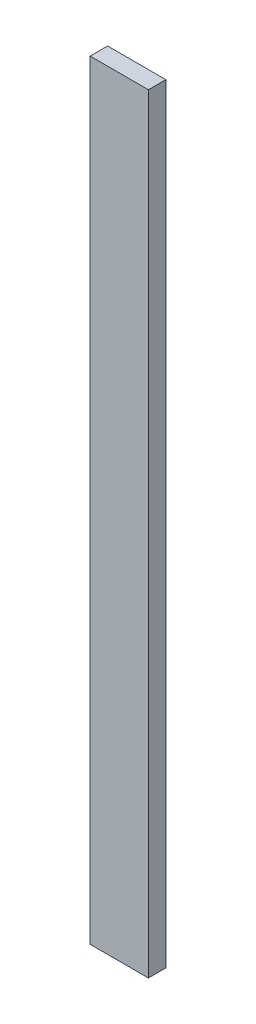
ISO-10303-21;
HEADER;
FILE_DESCRIPTION(('STEP AP214'),'2;1');
FILE_NAME('part.step','',(''),(''),'','','');
FILE_SCHEMA(('AUTOMOTIVE_DESIGN { 1 0 10303 214 1 1 1 1 }'));
ENDSEC;
DATA;
#1=APPLICATION_CONTEXT('core data for automotive mechanical design processes');
#2=APPLICATION_PROTOCOL_DEFINITION('international standard','automotive_design',2000,#1);
#3=PRODUCT_CONTEXT('',#1,'mechanical');
#4=PRODUCT('Part','Part','',(#3));
#5=PRODUCT_RELATED_PRODUCT_CATEGORY('part','',(#4));
#6=PRODUCT_DEFINITION_FORMATION('','',#4);
#7=PRODUCT_DEFINITION_CONTEXT('part definition',#1,'design');
#8=PRODUCT_DEFINITION('design','',#6,#7);
#9=PRODUCT_DEFINITION_SHAPE('','',#8);
#10=(LENGTH_UNIT() NAMED_UNIT(*) SI_UNIT(.MILLI.,.METRE.));
#11=(NAMED_UNIT(*) PLANE_ANGLE_UNIT() SI_UNIT($,.RADIAN.));
#12=(NAMED_UNIT(*) SI_UNIT($,.STERADIAN.) SOLID_ANGLE_UNIT());
#13=UNCERTAINTY_MEASURE_WITH_UNIT(LENGTH_MEASURE(1.E-05),#10,'distance_accuracy_value','');
#14=(GEOMETRIC_REPRESENTATION_CONTEXT(3) GLOBAL_UNCERTAINTY_ASSIGNED_CONTEXT((#13)) GLOBAL_UNIT_ASSIGNED_CONTEXT((#10,
#11,#12)) REPRESENTATION_CONTEXT('',''));
#15=CARTESIAN_POINT('',(0.,0.,0.));
#16=DIRECTION('',(0.,0.,1.));
#17=DIRECTION('',(1.,0.,0.));
#18=AXIS2_PLACEMENT_3D('',#15,#16,#17);
#19=CARTESIAN_POINT('',(-49.1419551742583,806.824751696435,19.05));
#20=DIRECTION('',(0.,-1.,0.));
#21=DIRECTION('',(0.,0.,-1.));
#22=AXIS2_PLACEMENT_3D('',#19,#20,#21);
#23=PLANE('',#22);
#24=DIRECTION('',(-1.,0.,0.));
#25=VECTOR('',#24,1.);
#26=CARTESIAN_POINT('',(-49.1419551742583,806.824751696435,0.));
#27=LINE('',#26,#25);
#28=CARTESIAN_POINT('',(14.3580448257418,806.824751696435,0.));
#29=VERTEX_POINT('',#28);
#30=CARTESIAN_POINT('',(-49.1419551742583,806.824751696435,0.));
#31=VERTEX_POINT('',#30);
#32=EDGE_CURVE('E95',#29,#31,#27,.T.);
#33=ORIENTED_EDGE('',*,*,#32,.T.);
#34=DIRECTION('',(0.,0.,-1.));
#35=VECTOR('',#34,1.);
#36=CARTESIAN_POINT('',(-49.1419551742583,806.824751696435,19.05));
#37=LINE('',#36,#35);
#38=CARTESIAN_POINT('',(-49.1419551742583,806.824751696435,19.05));
#39=VERTEX_POINT('',#38);
#40=EDGE_CURVE('E11',#39,#31,#37,.T.);
#41=ORIENTED_EDGE('',*,*,#40,.F.);
#42=DIRECTION('',(-1.,0.,0.));
#43=VECTOR('',#42,1.);
#44=CARTESIAN_POINT('',(-49.1419551742583,806.824751696435,19.05));
#45=LINE('',#44,#43);
#46=CARTESIAN_POINT('',(14.3580448257418,806.824751696435,19.05));
#47=VERTEX_POINT('',#46);
#48=EDGE_CURVE('E83',#47,#39,#45,.T.);
#49=ORIENTED_EDGE('',*,*,#48,.F.);
#50=DIRECTION('',(0.,0.,-1.));
#51=VECTOR('',#50,1.);
#52=CARTESIAN_POINT('',(14.3580448257418,806.824751696435,19.05));
#53=LINE('',#52,#51);
#54=EDGE_CURVE('E91',#47,#29,#53,.T.);
#55=ORIENTED_EDGE('',*,*,#54,.T.);
#56=EDGE_LOOP('',(#33,#41,#49,#55));
#57=FACE_BOUND('',#56,.T.);
#58=ADVANCED_FACE('F32',(#57),#23,.F.);
#59=CARTESIAN_POINT('',(-49.1419551742583,806.824751696435,19.05));
#60=DIRECTION('',(1.,0.,0.));
#61=DIRECTION('',(0.,1.,0.));
#62=AXIS2_PLACEMENT_3D('',#59,#60,#61);
#63=PLANE('',#62);
#64=DIRECTION('',(0.,-1.,0.));
#65=VECTOR('',#64,1.);
#66=CARTESIAN_POINT('',(-49.1419551742583,806.824751696435,0.));
#67=LINE('',#66,#65);
#68=CARTESIAN_POINT('',(-49.1419551742582,-31.3752483035649,0.));
#69=VERTEX_POINT('',#68);
#70=EDGE_CURVE('E87',#31,#69,#67,.T.);
#71=ORIENTED_EDGE('',*,*,#70,.T.);
#72=DIRECTION('',(0.,0.,-1.));
#73=VECTOR('',#72,1.);
#74=CARTESIAN_POINT('',(-49.1419551742582,-31.3752483035649,19.05));
#75=LINE('',#74,#73);
#76=CARTESIAN_POINT('',(-49.1419551742582,-31.3752483035649,19.05));
#77=VERTEX_POINT('',#76);
#78=EDGE_CURVE('E40',#77,#69,#75,.T.);
#79=ORIENTED_EDGE('',*,*,#78,.F.);
#80=DIRECTION('',(0.,-1.,0.));
#81=VECTOR('',#80,1.);
#82=CARTESIAN_POINT('',(-49.1419551742583,806.824751696435,19.05));
#83=LINE('',#82,#81);
#84=EDGE_CURVE('E78',#39,#77,#83,.T.);
#85=ORIENTED_EDGE('',*,*,#84,.F.);
#86=ORIENTED_EDGE('',*,*,#40,.T.);
#87=EDGE_LOOP('',(#71,#79,#85,#86));
#88=FACE_BOUND('',#87,.T.);
#89=ADVANCED_FACE('F86',(#88),#63,.F.);
#90=CARTESIAN_POINT('',(-49.1419551742582,-31.3752483035649,19.05));
#91=DIRECTION('',(0.,1.,0.));
#92=DIRECTION('',(0.,0.,1.));
#93=AXIS2_PLACEMENT_3D('',#90,#91,#92);
#94=PLANE('',#93);
#95=DIRECTION('',(1.,0.,0.));
#96=VECTOR('',#95,1.);
#97=CARTESIAN_POINT('',(-49.1419551742582,-31.3752483035649,0.));
#98=LINE('',#97,#96);
#99=CARTESIAN_POINT('',(14.3580448257418,-31.3752483035649,0.));
#100=VERTEX_POINT('',#99);
#101=EDGE_CURVE('E65',#69,#100,#98,.T.);
#102=ORIENTED_EDGE('',*,*,#101,.T.);
#103=DIRECTION('',(0.,0.,-1.));
#104=VECTOR('',#103,1.);
#105=CARTESIAN_POINT('',(14.3580448257418,-31.3752483035649,19.05));
#106=LINE('',#105,#104);
#107=CARTESIAN_POINT('',(14.3580448257418,-31.3752483035649,19.05));
#108=VERTEX_POINT('',#107);
#109=EDGE_CURVE('E88',#108,#100,#106,.T.);
#110=ORIENTED_EDGE('',*,*,#109,.F.);
#111=DIRECTION('',(1.,0.,0.));
#112=VECTOR('',#111,1.);
#113=CARTESIAN_POINT('',(-49.1419551742582,-31.3752483035649,19.05));
#114=LINE('',#113,#112);
#115=EDGE_CURVE('E81',#77,#108,#114,.T.);
#116=ORIENTED_EDGE('',*,*,#115,.F.);
#117=ORIENTED_EDGE('',*,*,#78,.T.);
#118=EDGE_LOOP('',(#102,#110,#116,#117));
#119=FACE_BOUND('',#118,.T.);
#120=ADVANCED_FACE('F89',(#119),#94,.F.);
#121=CARTESIAN_POINT('',(14.3580448257418,-31.3752483035649,19.05));
#122=DIRECTION('',(-1.,0.,0.));
#123=DIRECTION('',(0.,0.,1.));
#124=AXIS2_PLACEMENT_3D('',#121,#122,#123);
#125=PLANE('',#124);
#126=DIRECTION('',(0.,1.,0.));
#127=VECTOR('',#126,1.);
#128=CARTESIAN_POINT('',(14.3580448257418,-31.3752483035649,0.));
#129=LINE('',#128,#127);
#130=EDGE_CURVE('E71',#100,#29,#129,.T.);
#131=ORIENTED_EDGE('',*,*,#130,.T.);
#132=ORIENTED_EDGE('',*,*,#54,.F.);
#133=DIRECTION('',(0.,1.,0.));
#134=VECTOR('',#133,1.);
#135=CARTESIAN_POINT('',(14.3580448257418,-31.3752483035649,19.05));
#136=LINE('',#135,#134);
#137=EDGE_CURVE('E48',#108,#47,#136,.T.);
#138=ORIENTED_EDGE('',*,*,#137,.F.);
#139=ORIENTED_EDGE('',*,*,#109,.T.);
#140=EDGE_LOOP('',(#131,#132,#138,#139));
#141=FACE_BOUND('',#140,.T.);
#142=ADVANCED_FACE('F102',(#141),#125,.F.);
#143=CARTESIAN_POINT('',(0.,0.,19.05));
#144=DIRECTION('',(0.,0.,1.));
#145=DIRECTION('',(1.,0.,0.));
#146=AXIS2_PLACEMENT_3D('',#143,#144,#145);
#147=PLANE('',#146);
#148=ORIENTED_EDGE('',*,*,#48,.T.);
#149=ORIENTED_EDGE('',*,*,#84,.T.);
#150=ORIENTED_EDGE('',*,*,#115,.T.);
#151=ORIENTED_EDGE('',*,*,#137,.T.);
#152=EDGE_LOOP('',(#148,#149,#150,#151));
#153=FACE_BOUND('',#152,.T.);
#154=ADVANCED_FACE('F79',(#153),#147,.T.);
#155=CARTESIAN_POINT('',(0.,0.,0.));
#156=DIRECTION('',(0.,0.,1.));
#157=DIRECTION('',(1.,0.,0.));
#158=AXIS2_PLACEMENT_3D('',#155,#156,#157);
#159=PLANE('',#158);
#160=ORIENTED_EDGE('',*,*,#32,.F.);
#161=ORIENTED_EDGE('',*,*,#130,.F.);
#162=ORIENTED_EDGE('',*,*,#101,.F.);
#163=ORIENTED_EDGE('',*,*,#70,.F.);
#164=EDGE_LOOP('',(#160,#161,#162,#163));
#165=FACE_BOUND('',#164,.T.);
#166=ADVANCED_FACE('F105',(#165),#159,.F.);
#167=CLOSED_SHELL('',(#58,#89,#120,#142,#154,#166));
#168=MANIFOLD_SOLID_BREP('B2',#167);
#169=ADVANCED_BREP_SHAPE_REPRESENTATION('',(#18,#168),#14);
#170=SHAPE_DEFINITION_REPRESENTATION(#9,#169);
ENDSEC;
END-ISO-10303-21;
